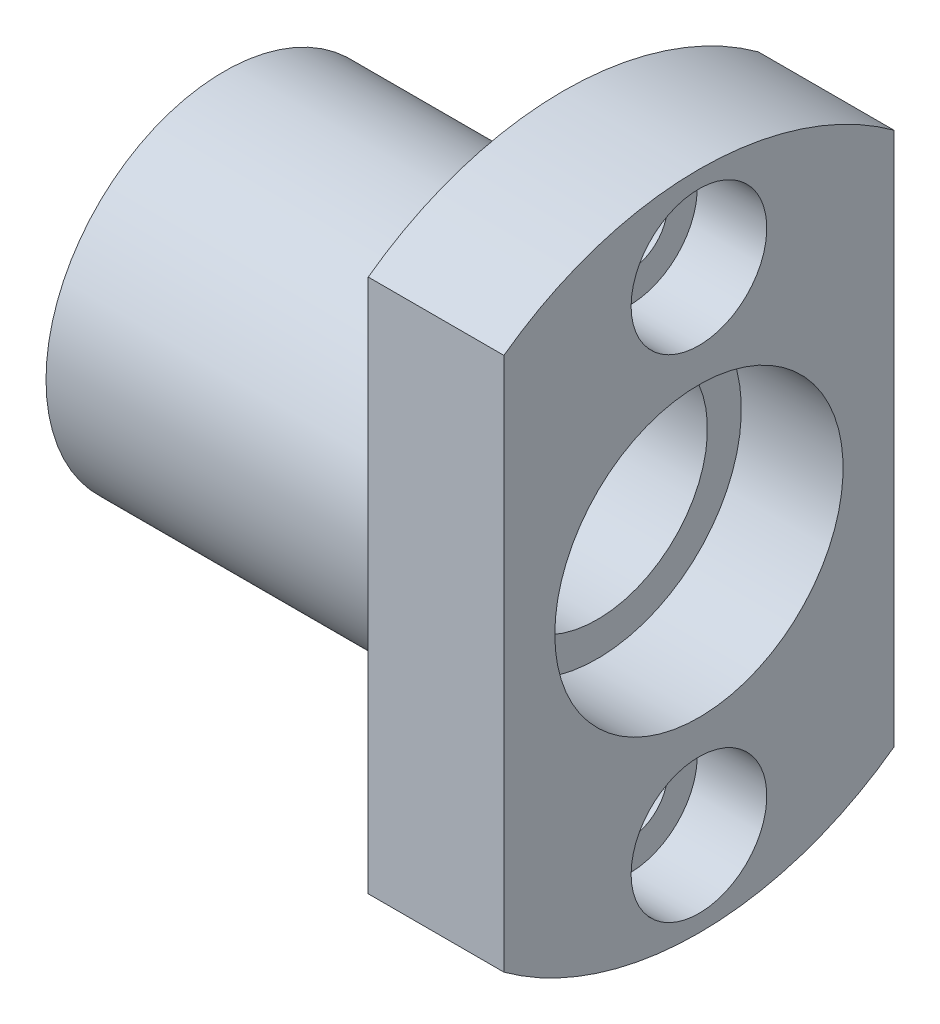
ISO-10303-21;
HEADER;
FILE_DESCRIPTION(('STEP AP214'),'2;1');
FILE_NAME('part.step','',(''),(''),'','','');
FILE_SCHEMA(('AUTOMOTIVE_DESIGN { 1 0 10303 214 1 1 1 1 }'));
ENDSEC;
DATA;
#1=APPLICATION_CONTEXT('core data for automotive mechanical design processes');
#2=APPLICATION_PROTOCOL_DEFINITION('international standard','automotive_design',2000,#1);
#3=PRODUCT_CONTEXT('',#1,'mechanical');
#4=PRODUCT('Part','Part','',(#3));
#5=PRODUCT_RELATED_PRODUCT_CATEGORY('part','',(#4));
#6=PRODUCT_DEFINITION_FORMATION('','',#4);
#7=PRODUCT_DEFINITION_CONTEXT('part definition',#1,'design');
#8=PRODUCT_DEFINITION('design','',#6,#7);
#9=PRODUCT_DEFINITION_SHAPE('','',#8);
#10=(LENGTH_UNIT() NAMED_UNIT(*) SI_UNIT(.MILLI.,.METRE.));
#11=(NAMED_UNIT(*) PLANE_ANGLE_UNIT() SI_UNIT($,.RADIAN.));
#12=(NAMED_UNIT(*) SI_UNIT($,.STERADIAN.) SOLID_ANGLE_UNIT());
#13=UNCERTAINTY_MEASURE_WITH_UNIT(LENGTH_MEASURE(1.E-05),#10,'distance_accuracy_value','');
#14=(GEOMETRIC_REPRESENTATION_CONTEXT(3) GLOBAL_UNCERTAINTY_ASSIGNED_CONTEXT((#13)) GLOBAL_UNIT_ASSIGNED_CONTEXT((#10,
#11,#12)) REPRESENTATION_CONTEXT('',''));
#15=CARTESIAN_POINT('',(0.,0.,0.));
#16=DIRECTION('',(0.,0.,1.));
#17=DIRECTION('',(1.,0.,0.));
#18=AXIS2_PLACEMENT_3D('',#15,#16,#17);
#19=CARTESIAN_POINT('',(0.,8.5,0.));
#20=DIRECTION('',(-1.,0.,0.));
#21=DIRECTION('',(0.,0.,1.));
#22=AXIS2_PLACEMENT_3D('',#19,#20,#21);
#23=PLANE('',#22);
#24=CARTESIAN_POINT('',(0.,-14.5,0.));
#25=DIRECTION('',(-1.,0.,0.));
#26=DIRECTION('',(0.,0.,1.));
#27=AXIS2_PLACEMENT_3D('',#24,#25,#26);
#28=CIRCLE('',#27,4.);
#29=CARTESIAN_POINT('',(0.,-14.5,4.));
#30=VERTEX_POINT('',#29);
#31=EDGE_CURVE('E125',#30,#30,#28,.T.);
#32=ORIENTED_EDGE('',*,*,#31,.T.);
#33=EDGE_LOOP('',(#32));
#34=FACE_BOUND('',#33,.T.);
#35=CARTESIAN_POINT('',(0.,14.5,0.));
#36=DIRECTION('',(-1.,0.,0.));
#37=DIRECTION('',(0.,0.,1.));
#38=AXIS2_PLACEMENT_3D('',#35,#36,#37);
#39=CIRCLE('',#38,4.);
#40=CARTESIAN_POINT('',(0.,14.5,4.));
#41=VERTEX_POINT('',#40);
#42=EDGE_CURVE('E137',#41,#41,#39,.T.);
#43=ORIENTED_EDGE('',*,*,#42,.T.);
#44=EDGE_LOOP('',(#43));
#45=FACE_BOUND('',#44,.T.);
#46=CARTESIAN_POINT('',(0.,0.,0.));
#47=DIRECTION('',(-1.,0.,0.));
#48=DIRECTION('',(0.,0.,1.));
#49=AXIS2_PLACEMENT_3D('',#46,#47,#48);
#50=CIRCLE('',#49,8.5);
#51=CARTESIAN_POINT('',(0.,0.,8.5));
#52=VERTEX_POINT('',#51);
#53=EDGE_CURVE('E93',#52,#52,#50,.T.);
#54=ORIENTED_EDGE('',*,*,#53,.T.);
#55=EDGE_LOOP('',(#54));
#56=FACE_BOUND('',#55,.T.);
#57=DIRECTION('',(0.,1.,0.));
#58=VECTOR('',#57,1.);
#59=CARTESIAN_POINT('',(0.,-19.5,-11.5));
#60=LINE('',#59,#58);
#61=CARTESIAN_POINT('',(0.,-15.7480157480236,-11.5));
#62=VERTEX_POINT('',#61);
#63=CARTESIAN_POINT('',(0.,15.7480157480236,-11.5));
#64=VERTEX_POINT('',#63);
#65=EDGE_CURVE('E81',#62,#64,#60,.T.);
#66=ORIENTED_EDGE('',*,*,#65,.T.);
#67=CARTESIAN_POINT('',(0.,0.,0.));
#68=DIRECTION('',(-1.,0.,0.));
#69=DIRECTION('',(0.,0.,1.));
#70=AXIS2_PLACEMENT_3D('',#67,#68,#69);
#71=CIRCLE('',#70,19.5);
#72=CARTESIAN_POINT('',(0.,15.7480157480236,11.5));
#73=VERTEX_POINT('',#72);
#74=EDGE_CURVE('E87',#73,#64,#71,.T.);
#75=ORIENTED_EDGE('',*,*,#74,.F.);
#76=DIRECTION('',(0.,-1.,0.));
#77=VECTOR('',#76,1.);
#78=CARTESIAN_POINT('',(0.,19.5,11.5));
#79=LINE('',#78,#77);
#80=CARTESIAN_POINT('',(0.,-15.7480157480236,11.5));
#81=VERTEX_POINT('',#80);
#82=EDGE_CURVE('E74',#73,#81,#79,.T.);
#83=ORIENTED_EDGE('',*,*,#82,.T.);
#84=EDGE_CURVE('E94',#62,#81,#71,.T.);
#85=ORIENTED_EDGE('',*,*,#84,.F.);
#86=EDGE_LOOP('',(#66,#75,#83,#85));
#87=FACE_BOUND('',#86,.T.);
#88=ADVANCED_FACE('F33',(#34,#45,#56,#87),#23,.F.);
#89=CARTESIAN_POINT('',(0.,0.,0.));
#90=DIRECTION('',(-1.,0.,0.));
#91=DIRECTION('',(0.,0.,1.));
#92=AXIS2_PLACEMENT_3D('',#89,#90,#91);
#93=CYLINDRICAL_SURFACE('',#92,19.5);
#94=ORIENTED_EDGE('',*,*,#74,.T.);
#95=DIRECTION('',(-1.,0.,0.));
#96=VECTOR('',#95,1.);
#97=CARTESIAN_POINT('',(0.,15.7480157480236,-11.5));
#98=LINE('',#97,#96);
#99=CARTESIAN_POINT('',(-8.,15.7480157480236,-11.5));
#100=VERTEX_POINT('',#99);
#101=EDGE_CURVE('E90',#100,#64,#98,.F.);
#102=ORIENTED_EDGE('',*,*,#101,.F.);
#103=CARTESIAN_POINT('',(-8.,0.,0.));
#104=DIRECTION('',(-1.,0.,0.));
#105=DIRECTION('',(0.,0.,1.));
#106=AXIS2_PLACEMENT_3D('',#103,#104,#105);
#107=CIRCLE('',#106,19.5);
#108=CARTESIAN_POINT('',(-8.,15.7480157480236,11.5));
#109=VERTEX_POINT('',#108);
#110=EDGE_CURVE('E89',#109,#100,#107,.T.);
#111=ORIENTED_EDGE('',*,*,#110,.F.);
#112=DIRECTION('',(-1.,0.,0.));
#113=VECTOR('',#112,1.);
#114=CARTESIAN_POINT('',(0.,15.7480157480236,11.5));
#115=LINE('',#114,#113);
#116=EDGE_CURVE('E55',#73,#109,#115,.T.);
#117=ORIENTED_EDGE('',*,*,#116,.F.);
#118=EDGE_LOOP('',(#94,#102,#111,#117));
#119=FACE_BOUND('',#118,.T.);
#120=ADVANCED_FACE('F85',(#119),#93,.T.);
#121=DIRECTION('',(-1.,0.,0.));
#122=VECTOR('',#121,1.);
#123=CARTESIAN_POINT('',(0.,-15.7480157480236,11.5));
#124=LINE('',#123,#122);
#125=CARTESIAN_POINT('',(-8.,-15.7480157480236,11.5));
#126=VERTEX_POINT('',#125);
#127=EDGE_CURVE('E77',#126,#81,#124,.F.);
#128=ORIENTED_EDGE('',*,*,#127,.F.);
#129=CARTESIAN_POINT('',(-8.,-15.7480157480236,-11.5));
#130=VERTEX_POINT('',#129);
#131=EDGE_CURVE('E119',#130,#126,#107,.T.);
#132=ORIENTED_EDGE('',*,*,#131,.F.);
#133=DIRECTION('',(-1.,0.,0.));
#134=VECTOR('',#133,1.);
#135=CARTESIAN_POINT('',(0.,-15.7480157480236,-11.5));
#136=LINE('',#135,#134);
#137=EDGE_CURVE('E47',#62,#130,#136,.T.);
#138=ORIENTED_EDGE('',*,*,#137,.F.);
#139=ORIENTED_EDGE('',*,*,#84,.T.);
#140=EDGE_LOOP('',(#128,#132,#138,#139));
#141=FACE_BOUND('',#140,.T.);
#142=ADVANCED_FACE('F118',(#141),#93,.T.);
#143=CARTESIAN_POINT('',(-8.,19.5,0.));
#144=DIRECTION('',(1.,0.,0.));
#145=DIRECTION('',(0.,0.,-1.));
#146=AXIS2_PLACEMENT_3D('',#143,#144,#145);
#147=PLANE('',#146);
#148=CARTESIAN_POINT('',(-8.,-14.5,0.));
#149=DIRECTION('',(-1.,0.,0.));
#150=DIRECTION('',(0.,0.,1.));
#151=AXIS2_PLACEMENT_3D('',#148,#149,#150);
#152=CIRCLE('',#151,2.25);
#153=CARTESIAN_POINT('',(-8.,-14.5,2.25));
#154=VERTEX_POINT('',#153);
#155=EDGE_CURVE('E134',#154,#154,#152,.T.);
#156=ORIENTED_EDGE('',*,*,#155,.F.);
#157=EDGE_LOOP('',(#156));
#158=FACE_BOUND('',#157,.T.);
#159=CARTESIAN_POINT('',(-8.,14.5,0.));
#160=DIRECTION('',(-1.,0.,0.));
#161=DIRECTION('',(0.,0.,1.));
#162=AXIS2_PLACEMENT_3D('',#159,#160,#161);
#163=CIRCLE('',#162,2.25);
#164=CARTESIAN_POINT('',(-8.,14.5,2.25));
#165=VERTEX_POINT('',#164);
#166=EDGE_CURVE('E146',#165,#165,#163,.T.);
#167=ORIENTED_EDGE('',*,*,#166,.F.);
#168=EDGE_LOOP('',(#167));
#169=FACE_BOUND('',#168,.T.);
#170=CARTESIAN_POINT('',(-8.,0.,0.));
#171=DIRECTION('',(-1.,0.,0.));
#172=DIRECTION('',(0.,0.,1.));
#173=AXIS2_PLACEMENT_3D('',#170,#171,#172);
#174=CIRCLE('',#173,10.5);
#175=CARTESIAN_POINT('',(-8.,0.,10.5));
#176=VERTEX_POINT('',#175);
#177=EDGE_CURVE('E151',#176,#176,#174,.T.);
#178=ORIENTED_EDGE('',*,*,#177,.F.);
#179=EDGE_LOOP('',(#178));
#180=FACE_BOUND('',#179,.T.);
#181=DIRECTION('',(0.,1.,0.));
#182=VECTOR('',#181,1.);
#183=CARTESIAN_POINT('',(-8.,19.5,-11.5));
#184=LINE('',#183,#182);
#185=EDGE_CURVE('E11',#130,#100,#184,.T.);
#186=ORIENTED_EDGE('',*,*,#185,.F.);
#187=ORIENTED_EDGE('',*,*,#131,.T.);
#188=DIRECTION('',(0.,-1.,0.));
#189=VECTOR('',#188,1.);
#190=CARTESIAN_POINT('',(-8.,19.5,11.5));
#191=LINE('',#190,#189);
#192=EDGE_CURVE('E41',#109,#126,#191,.T.);
#193=ORIENTED_EDGE('',*,*,#192,.F.);
#194=ORIENTED_EDGE('',*,*,#110,.T.);
#195=EDGE_LOOP('',(#186,#187,#193,#194));
#196=FACE_BOUND('',#195,.T.);
#197=ADVANCED_FACE('F155',(#158,#169,#180,#196),#147,.F.);
#198=CARTESIAN_POINT('',(-28.,10.5,0.));
#199=DIRECTION('',(1.,0.,0.));
#200=DIRECTION('',(0.,0.,-1.));
#201=AXIS2_PLACEMENT_3D('',#198,#199,#200);
#202=PLANE('',#201);
#203=CARTESIAN_POINT('',(-28.,0.,0.));
#204=DIRECTION('',(-1.,0.,0.));
#205=DIRECTION('',(0.,0.,1.));
#206=AXIS2_PLACEMENT_3D('',#203,#204,#205);
#207=CIRCLE('',#206,8.5);
#208=CARTESIAN_POINT('',(-28.,0.,8.5));
#209=VERTEX_POINT('',#208);
#210=EDGE_CURVE('E113',#209,#209,#207,.T.);
#211=ORIENTED_EDGE('',*,*,#210,.F.);
#212=EDGE_LOOP('',(#211));
#213=FACE_BOUND('',#212,.T.);
#214=CARTESIAN_POINT('',(-28.,0.,0.));
#215=DIRECTION('',(-1.,0.,0.));
#216=DIRECTION('',(0.,0.,1.));
#217=AXIS2_PLACEMENT_3D('',#214,#215,#216);
#218=CIRCLE('',#217,10.5);
#219=CARTESIAN_POINT('',(-28.,0.,10.5));
#220=VERTEX_POINT('',#219);
#221=EDGE_CURVE('E149',#220,#220,#218,.T.);
#222=ORIENTED_EDGE('',*,*,#221,.T.);
#223=EDGE_LOOP('',(#222));
#224=FACE_BOUND('',#223,.T.);
#225=ADVANCED_FACE('F35',(#213,#224),#202,.F.);
#226=CARTESIAN_POINT('',(0.,0.,0.));
#227=DIRECTION('',(-1.,0.,0.));
#228=DIRECTION('',(0.,0.,1.));
#229=AXIS2_PLACEMENT_3D('',#226,#227,#228);
#230=CYLINDRICAL_SURFACE('',#229,8.5);
#231=CARTESIAN_POINT('',(-22.,0.,0.));
#232=DIRECTION('',(-1.,0.,0.));
#233=DIRECTION('',(0.,0.,1.));
#234=AXIS2_PLACEMENT_3D('',#231,#232,#233);
#235=CIRCLE('',#234,8.5);
#236=CARTESIAN_POINT('',(-22.,0.,8.5));
#237=VERTEX_POINT('',#236);
#238=EDGE_CURVE('E110',#237,#237,#235,.T.);
#239=ORIENTED_EDGE('',*,*,#238,.F.);
#240=EDGE_LOOP('',(#239));
#241=FACE_BOUND('',#240,.T.);
#242=ORIENTED_EDGE('',*,*,#210,.T.);
#243=EDGE_LOOP('',(#242));
#244=FACE_BOUND('',#243,.T.);
#245=ADVANCED_FACE('F189',(#241,#244),#230,.F.);
#246=CARTESIAN_POINT('',(-22.,8.5,0.));
#247=DIRECTION('',(1.,0.,0.));
#248=DIRECTION('',(0.,0.,-1.));
#249=AXIS2_PLACEMENT_3D('',#246,#247,#248);
#250=PLANE('',#249);
#251=CARTESIAN_POINT('',(-22.,0.,0.));
#252=DIRECTION('',(-1.,0.,0.));
#253=DIRECTION('',(0.,0.,1.));
#254=AXIS2_PLACEMENT_3D('',#251,#252,#253);
#255=CIRCLE('',#254,6.5);
#256=CARTESIAN_POINT('',(-22.,0.,6.5));
#257=VERTEX_POINT('',#256);
#258=EDGE_CURVE('E107',#257,#257,#255,.T.);
#259=ORIENTED_EDGE('',*,*,#258,.F.);
#260=EDGE_LOOP('',(#259));
#261=FACE_BOUND('',#260,.T.);
#262=ORIENTED_EDGE('',*,*,#238,.T.);
#263=EDGE_LOOP('',(#262));
#264=FACE_BOUND('',#263,.T.);
#265=ADVANCED_FACE('F186',(#261,#264),#250,.F.);
#266=CARTESIAN_POINT('',(0.,0.,0.));
#267=DIRECTION('',(-1.,0.,0.));
#268=DIRECTION('',(0.,0.,1.));
#269=AXIS2_PLACEMENT_3D('',#266,#267,#268);
#270=CYLINDRICAL_SURFACE('',#269,6.5);
#271=CARTESIAN_POINT('',(-6.,0.,0.));
#272=DIRECTION('',(-1.,0.,0.));
#273=DIRECTION('',(0.,0.,1.));
#274=AXIS2_PLACEMENT_3D('',#271,#272,#273);
#275=CIRCLE('',#274,6.5);
#276=CARTESIAN_POINT('',(-6.,0.,6.5));
#277=VERTEX_POINT('',#276);
#278=EDGE_CURVE('E104',#277,#277,#275,.T.);
#279=ORIENTED_EDGE('',*,*,#278,.F.);
#280=EDGE_LOOP('',(#279));
#281=FACE_BOUND('',#280,.T.);
#282=ORIENTED_EDGE('',*,*,#258,.T.);
#283=EDGE_LOOP('',(#282));
#284=FACE_BOUND('',#283,.T.);
#285=ADVANCED_FACE('F182',(#281,#284),#270,.F.);
#286=CARTESIAN_POINT('',(-6.,6.5,0.));
#287=DIRECTION('',(-1.,0.,0.));
#288=DIRECTION('',(0.,0.,1.));
#289=AXIS2_PLACEMENT_3D('',#286,#287,#288);
#290=PLANE('',#289);
#291=CARTESIAN_POINT('',(-6.,0.,0.));
#292=DIRECTION('',(-1.,0.,0.));
#293=DIRECTION('',(0.,0.,1.));
#294=AXIS2_PLACEMENT_3D('',#291,#292,#293);
#295=CIRCLE('',#294,8.5);
#296=CARTESIAN_POINT('',(-6.,0.,8.5));
#297=VERTEX_POINT('',#296);
#298=EDGE_CURVE('E97',#297,#297,#295,.T.);
#299=ORIENTED_EDGE('',*,*,#298,.F.);
#300=EDGE_LOOP('',(#299));
#301=FACE_BOUND('',#300,.T.);
#302=ORIENTED_EDGE('',*,*,#278,.T.);
#303=EDGE_LOOP('',(#302));
#304=FACE_BOUND('',#303,.T.);
#305=ADVANCED_FACE('F178',(#301,#304),#290,.F.);
#306=CARTESIAN_POINT('',(0.,0.,0.));
#307=DIRECTION('',(-1.,0.,0.));
#308=DIRECTION('',(0.,0.,1.));
#309=AXIS2_PLACEMENT_3D('',#306,#307,#308);
#310=CYLINDRICAL_SURFACE('',#309,8.5);
#311=ORIENTED_EDGE('',*,*,#53,.F.);
#312=EDGE_LOOP('',(#311));
#313=FACE_BOUND('',#312,.T.);
#314=ORIENTED_EDGE('',*,*,#298,.T.);
#315=EDGE_LOOP('',(#314));
#316=FACE_BOUND('',#315,.T.);
#317=ADVANCED_FACE('F174',(#313,#316),#310,.F.);
#318=CARTESIAN_POINT('',(0.,0.,0.));
#319=DIRECTION('',(-1.,0.,0.));
#320=DIRECTION('',(0.,0.,1.));
#321=AXIS2_PLACEMENT_3D('',#318,#319,#320);
#322=CYLINDRICAL_SURFACE('',#321,10.5);
#323=ORIENTED_EDGE('',*,*,#221,.F.);
#324=EDGE_LOOP('',(#323));
#325=FACE_BOUND('',#324,.T.);
#326=ORIENTED_EDGE('',*,*,#177,.T.);
#327=EDGE_LOOP('',(#326));
#328=FACE_BOUND('',#327,.T.);
#329=ADVANCED_FACE('F177',(#325,#328),#322,.T.);
#330=CARTESIAN_POINT('',(0.,14.5,0.));
#331=DIRECTION('',(-1.,0.,0.));
#332=DIRECTION('',(0.,0.,1.));
#333=AXIS2_PLACEMENT_3D('',#330,#331,#332);
#334=CYLINDRICAL_SURFACE('',#333,2.25);
#335=ORIENTED_EDGE('',*,*,#166,.T.);
#336=EDGE_LOOP('',(#335));
#337=FACE_BOUND('',#336,.T.);
#338=CARTESIAN_POINT('',(-4.1,14.5,0.));
#339=DIRECTION('',(-1.,0.,0.));
#340=DIRECTION('',(0.,0.,1.));
#341=AXIS2_PLACEMENT_3D('',#338,#339,#340);
#342=CIRCLE('',#341,2.25);
#343=CARTESIAN_POINT('',(-4.1,14.5,2.25));
#344=VERTEX_POINT('',#343);
#345=EDGE_CURVE('E143',#344,#344,#342,.T.);
#346=ORIENTED_EDGE('',*,*,#345,.F.);
#347=EDGE_LOOP('',(#346));
#348=FACE_BOUND('',#347,.T.);
#349=ADVANCED_FACE('F204',(#337,#348),#334,.F.);
#350=CARTESIAN_POINT('',(-4.1,16.75,0.));
#351=DIRECTION('',(1.,0.,0.));
#352=DIRECTION('',(0.,0.,-1.));
#353=AXIS2_PLACEMENT_3D('',#350,#351,#352);
#354=PLANE('',#353);
#355=ORIENTED_EDGE('',*,*,#345,.T.);
#356=EDGE_LOOP('',(#355));
#357=FACE_BOUND('',#356,.T.);
#358=CARTESIAN_POINT('',(-4.1,14.5,0.));
#359=DIRECTION('',(-1.,0.,0.));
#360=DIRECTION('',(0.,0.,1.));
#361=AXIS2_PLACEMENT_3D('',#358,#359,#360);
#362=CIRCLE('',#361,4.);
#363=CARTESIAN_POINT('',(-4.1,14.5,4.));
#364=VERTEX_POINT('',#363);
#365=EDGE_CURVE('E140',#364,#364,#362,.T.);
#366=ORIENTED_EDGE('',*,*,#365,.F.);
#367=EDGE_LOOP('',(#366));
#368=FACE_BOUND('',#367,.T.);
#369=ADVANCED_FACE('F209',(#357,#368),#354,.T.);
#370=CARTESIAN_POINT('',(0.,14.5,0.));
#371=DIRECTION('',(-1.,0.,0.));
#372=DIRECTION('',(0.,0.,1.));
#373=AXIS2_PLACEMENT_3D('',#370,#371,#372);
#374=CYLINDRICAL_SURFACE('',#373,4.);
#375=ORIENTED_EDGE('',*,*,#365,.T.);
#376=EDGE_LOOP('',(#375));
#377=FACE_BOUND('',#376,.T.);
#378=ORIENTED_EDGE('',*,*,#42,.F.);
#379=EDGE_LOOP('',(#378));
#380=FACE_BOUND('',#379,.T.);
#381=ADVANCED_FACE('F227',(#377,#380),#374,.F.);
#382=CARTESIAN_POINT('',(0.,-14.5,0.));
#383=DIRECTION('',(-1.,0.,0.));
#384=DIRECTION('',(0.,0.,1.));
#385=AXIS2_PLACEMENT_3D('',#382,#383,#384);
#386=CYLINDRICAL_SURFACE('',#385,2.25);
#387=ORIENTED_EDGE('',*,*,#155,.T.);
#388=EDGE_LOOP('',(#387));
#389=FACE_BOUND('',#388,.T.);
#390=CARTESIAN_POINT('',(-4.1,-14.5,0.));
#391=DIRECTION('',(-1.,0.,0.));
#392=DIRECTION('',(0.,0.,1.));
#393=AXIS2_PLACEMENT_3D('',#390,#391,#392);
#394=CIRCLE('',#393,2.25);
#395=CARTESIAN_POINT('',(-4.1,-14.5,2.25));
#396=VERTEX_POINT('',#395);
#397=EDGE_CURVE('E131',#396,#396,#394,.T.);
#398=ORIENTED_EDGE('',*,*,#397,.F.);
#399=EDGE_LOOP('',(#398));
#400=FACE_BOUND('',#399,.T.);
#401=ADVANCED_FACE('F232',(#389,#400),#386,.F.);
#402=CARTESIAN_POINT('',(-4.1,-12.25,0.));
#403=DIRECTION('',(1.,0.,0.));
#404=DIRECTION('',(0.,0.,-1.));
#405=AXIS2_PLACEMENT_3D('',#402,#403,#404);
#406=PLANE('',#405);
#407=ORIENTED_EDGE('',*,*,#397,.T.);
#408=EDGE_LOOP('',(#407));
#409=FACE_BOUND('',#408,.T.);
#410=CARTESIAN_POINT('',(-4.1,-14.5,0.));
#411=DIRECTION('',(-1.,0.,0.));
#412=DIRECTION('',(0.,0.,1.));
#413=AXIS2_PLACEMENT_3D('',#410,#411,#412);
#414=CIRCLE('',#413,4.);
#415=CARTESIAN_POINT('',(-4.1,-14.5,4.));
#416=VERTEX_POINT('',#415);
#417=EDGE_CURVE('E128',#416,#416,#414,.T.);
#418=ORIENTED_EDGE('',*,*,#417,.F.);
#419=EDGE_LOOP('',(#418));
#420=FACE_BOUND('',#419,.T.);
#421=ADVANCED_FACE('F247',(#409,#420),#406,.T.);
#422=CARTESIAN_POINT('',(0.,-14.5,0.));
#423=DIRECTION('',(-1.,0.,0.));
#424=DIRECTION('',(0.,0.,1.));
#425=AXIS2_PLACEMENT_3D('',#422,#423,#424);
#426=CYLINDRICAL_SURFACE('',#425,4.);
#427=ORIENTED_EDGE('',*,*,#417,.T.);
#428=EDGE_LOOP('',(#427));
#429=FACE_BOUND('',#428,.T.);
#430=ORIENTED_EDGE('',*,*,#31,.F.);
#431=EDGE_LOOP('',(#430));
#432=FACE_BOUND('',#431,.T.);
#433=ADVANCED_FACE('F162',(#429,#432),#426,.F.);
#434=CARTESIAN_POINT('',(-8.,19.5,11.5));
#435=DIRECTION('',(0.,0.,1.));
#436=DIRECTION('',(1.,0.,0.));
#437=AXIS2_PLACEMENT_3D('',#434,#435,#436);
#438=PLANE('',#437);
#439=ORIENTED_EDGE('',*,*,#116,.T.);
#440=ORIENTED_EDGE('',*,*,#192,.T.);
#441=ORIENTED_EDGE('',*,*,#127,.T.);
#442=ORIENTED_EDGE('',*,*,#82,.F.);
#443=EDGE_LOOP('',(#439,#440,#441,#442));
#444=FACE_BOUND('',#443,.T.);
#445=ADVANCED_FACE('F75',(#444),#438,.T.);
#446=CARTESIAN_POINT('',(-8.,-19.5,-11.5));
#447=DIRECTION('',(0.,0.,-1.));
#448=DIRECTION('',(-1.,0.,0.));
#449=AXIS2_PLACEMENT_3D('',#446,#447,#448);
#450=PLANE('',#449);
#451=ORIENTED_EDGE('',*,*,#137,.T.);
#452=ORIENTED_EDGE('',*,*,#185,.T.);
#453=ORIENTED_EDGE('',*,*,#101,.T.);
#454=ORIENTED_EDGE('',*,*,#65,.F.);
#455=EDGE_LOOP('',(#451,#452,#453,#454));
#456=FACE_BOUND('',#455,.T.);
#457=ADVANCED_FACE('F156',(#456),#450,.T.);
#458=CLOSED_SHELL('',(#88,#120,#142,#197,#225,#245,#265,#285,#305,#317,#329,#349,#369,#381,#401,
#421,#433,#445,#457));
#459=MANIFOLD_SOLID_BREP('B2',#458);
#460=ADVANCED_BREP_SHAPE_REPRESENTATION('',(#18,#459),#14);
#461=SHAPE_DEFINITION_REPRESENTATION(#9,#460);
ENDSEC;
END-ISO-10303-21;
